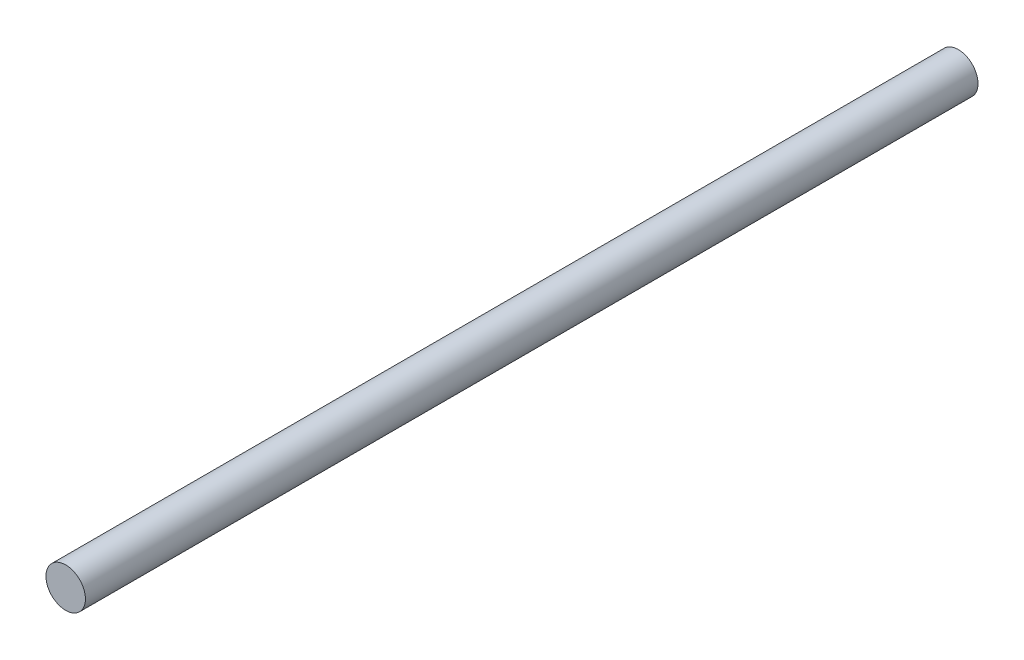
ISO-10303-21;
HEADER;
FILE_DESCRIPTION(('STEP AP214'),'2;1');
FILE_NAME('part.step','',(''),(''),'','','');
FILE_SCHEMA(('AUTOMOTIVE_DESIGN { 1 0 10303 214 1 1 1 1 }'));
ENDSEC;
DATA;
#1=APPLICATION_CONTEXT('core data for automotive mechanical design processes');
#2=APPLICATION_PROTOCOL_DEFINITION('international standard','automotive_design',2000,#1);
#3=PRODUCT_CONTEXT('',#1,'mechanical');
#4=PRODUCT('Part','Part','',(#3));
#5=PRODUCT_RELATED_PRODUCT_CATEGORY('part','',(#4));
#6=PRODUCT_DEFINITION_FORMATION('','',#4);
#7=PRODUCT_DEFINITION_CONTEXT('part definition',#1,'design');
#8=PRODUCT_DEFINITION('design','',#6,#7);
#9=PRODUCT_DEFINITION_SHAPE('','',#8);
#10=(LENGTH_UNIT() NAMED_UNIT(*) SI_UNIT(.MILLI.,.METRE.));
#11=(NAMED_UNIT(*) PLANE_ANGLE_UNIT() SI_UNIT($,.RADIAN.));
#12=(NAMED_UNIT(*) SI_UNIT($,.STERADIAN.) SOLID_ANGLE_UNIT());
#13=UNCERTAINTY_MEASURE_WITH_UNIT(LENGTH_MEASURE(1.E-05),#10,'distance_accuracy_value','');
#14=(GEOMETRIC_REPRESENTATION_CONTEXT(3) GLOBAL_UNCERTAINTY_ASSIGNED_CONTEXT((#13)) GLOBAL_UNIT_ASSIGNED_CONTEXT((#10,
#11,#12)) REPRESENTATION_CONTEXT('',''));
#15=CARTESIAN_POINT('',(0.,0.,0.));
#16=DIRECTION('',(0.,0.,1.));
#17=DIRECTION('',(1.,0.,0.));
#18=AXIS2_PLACEMENT_3D('',#15,#16,#17);
#19=CARTESIAN_POINT('',(0.,0.,110.));
#20=DIRECTION('',(0.,0.,-1.));
#21=DIRECTION('',(-1.,0.,0.));
#22=AXIS2_PLACEMENT_3D('',#19,#20,#21);
#23=CYLINDRICAL_SURFACE('',#22,4.8625);
#24=CARTESIAN_POINT('',(0.,0.,110.));
#25=DIRECTION('',(0.,0.,1.));
#26=DIRECTION('',(1.,0.,0.));
#27=AXIS2_PLACEMENT_3D('',#24,#25,#26);
#28=CIRCLE('',#27,4.8625);
#29=CARTESIAN_POINT('',(4.8625,0.,110.));
#30=VERTEX_POINT('',#29);
#31=EDGE_CURVE('E10',#30,#30,#28,.T.);
#32=ORIENTED_EDGE('',*,*,#31,.F.);
#33=EDGE_LOOP('',(#32));
#34=FACE_BOUND('',#33,.T.);
#35=CARTESIAN_POINT('',(0.,0.,-110.));
#36=DIRECTION('',(0.,0.,1.));
#37=DIRECTION('',(1.,0.,0.));
#38=AXIS2_PLACEMENT_3D('',#35,#36,#37);
#39=CIRCLE('',#38,4.8625);
#40=CARTESIAN_POINT('',(4.8625,0.,-110.));
#41=VERTEX_POINT('',#40);
#42=EDGE_CURVE('E33',#41,#41,#39,.T.);
#43=ORIENTED_EDGE('',*,*,#42,.T.);
#44=EDGE_LOOP('',(#43));
#45=FACE_BOUND('',#44,.T.);
#46=ADVANCED_FACE('F30',(#34,#45),#23,.T.);
#47=CARTESIAN_POINT('',(0.,0.,110.));
#48=DIRECTION('',(0.,0.,1.));
#49=DIRECTION('',(1.,0.,0.));
#50=AXIS2_PLACEMENT_3D('',#47,#48,#49);
#51=PLANE('',#50);
#52=ORIENTED_EDGE('',*,*,#31,.T.);
#53=EDGE_LOOP('',(#52));
#54=FACE_BOUND('',#53,.T.);
#55=ADVANCED_FACE('F45',(#54),#51,.T.);
#56=CARTESIAN_POINT('',(0.,0.,-110.));
#57=DIRECTION('',(0.,0.,1.));
#58=DIRECTION('',(1.,0.,0.));
#59=AXIS2_PLACEMENT_3D('',#56,#57,#58);
#60=PLANE('',#59);
#61=ORIENTED_EDGE('',*,*,#42,.F.);
#62=EDGE_LOOP('',(#61));
#63=FACE_BOUND('',#62,.T.);
#64=ADVANCED_FACE('F43',(#63),#60,.F.);
#65=CLOSED_SHELL('',(#46,#55,#64));
#66=MANIFOLD_SOLID_BREP('B2',#65);
#67=ADVANCED_BREP_SHAPE_REPRESENTATION('',(#18,#66),#14);
#68=SHAPE_DEFINITION_REPRESENTATION(#9,#67);
ENDSEC;
END-ISO-10303-21;
